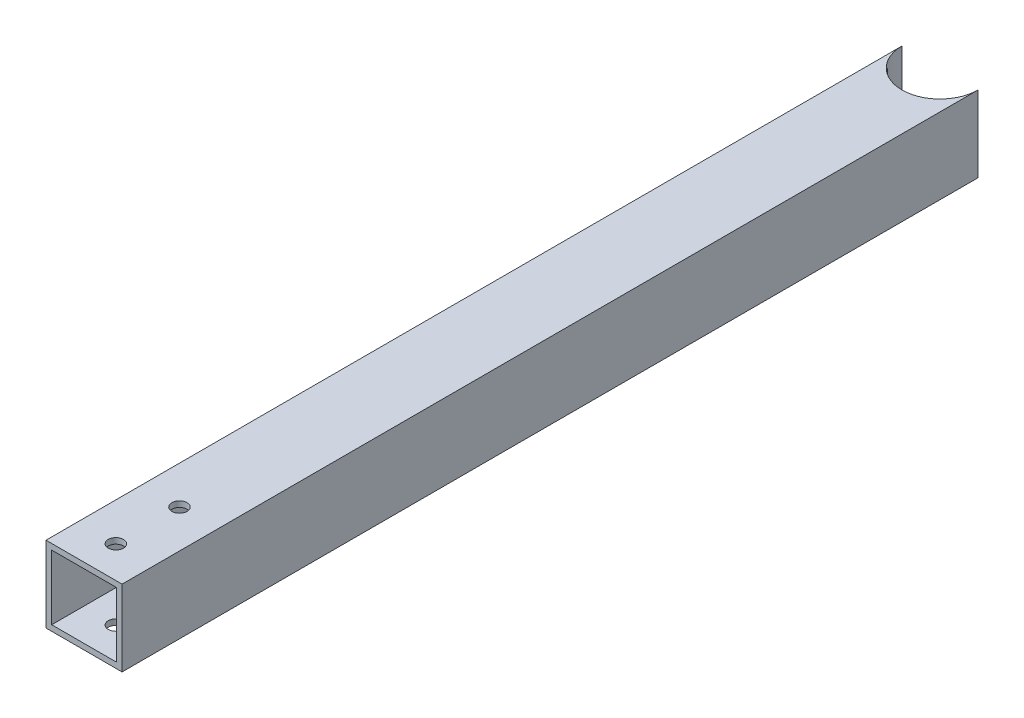
ISO-10303-21;
HEADER;
FILE_DESCRIPTION(('STEP AP214'),'2;1');
FILE_NAME('part.step','',(''),(''),'','','');
FILE_SCHEMA(('AUTOMOTIVE_DESIGN { 1 0 10303 214 1 1 1 1 }'));
ENDSEC;
DATA;
#1=APPLICATION_CONTEXT('core data for automotive mechanical design processes');
#2=APPLICATION_PROTOCOL_DEFINITION('international standard','automotive_design',2000,#1);
#3=PRODUCT_CONTEXT('',#1,'mechanical');
#4=PRODUCT('Part','Part','',(#3));
#5=PRODUCT_RELATED_PRODUCT_CATEGORY('part','',(#4));
#6=PRODUCT_DEFINITION_FORMATION('','',#4);
#7=PRODUCT_DEFINITION_CONTEXT('part definition',#1,'design');
#8=PRODUCT_DEFINITION('design','',#6,#7);
#9=PRODUCT_DEFINITION_SHAPE('','',#8);
#10=(LENGTH_UNIT() NAMED_UNIT(*) SI_UNIT(.MILLI.,.METRE.));
#11=(NAMED_UNIT(*) PLANE_ANGLE_UNIT() SI_UNIT($,.RADIAN.));
#12=(NAMED_UNIT(*) SI_UNIT($,.STERADIAN.) SOLID_ANGLE_UNIT());
#13=UNCERTAINTY_MEASURE_WITH_UNIT(LENGTH_MEASURE(1.E-05),#10,'distance_accuracy_value','');
#14=(GEOMETRIC_REPRESENTATION_CONTEXT(3) GLOBAL_UNCERTAINTY_ASSIGNED_CONTEXT((#13)) GLOBAL_UNIT_ASSIGNED_CONTEXT((#10,
#11,#12)) REPRESENTATION_CONTEXT('',''));
#15=CARTESIAN_POINT('',(0.,0.,0.));
#16=DIRECTION('',(0.,0.,1.));
#17=DIRECTION('',(1.,0.,0.));
#18=AXIS2_PLACEMENT_3D('',#15,#16,#17);
#19=CARTESIAN_POINT('',(0.,0.,450.));
#20=DIRECTION('',(0.,0.,-1.));
#21=DIRECTION('',(-1.,0.,0.));
#22=AXIS2_PLACEMENT_3D('',#19,#20,#21);
#23=PLANE('',#22);
#24=DIRECTION('',(0.,-1.,0.));
#25=VECTOR('',#24,1.);
#26=CARTESIAN_POINT('',(0.,0.,450.));
#27=LINE('',#26,#25);
#28=CARTESIAN_POINT('',(0.,40.,450.));
#29=VERTEX_POINT('',#28);
#30=CARTESIAN_POINT('',(0.,0.,450.));
#31=VERTEX_POINT('',#30);
#32=EDGE_CURVE('E133',#29,#31,#27,.T.);
#33=ORIENTED_EDGE('',*,*,#32,.T.);
#34=DIRECTION('',(1.,0.,0.));
#35=VECTOR('',#34,1.);
#36=CARTESIAN_POINT('',(0.,0.,450.));
#37=LINE('',#36,#35);
#38=CARTESIAN_POINT('',(40.,0.,450.));
#39=VERTEX_POINT('',#38);
#40=EDGE_CURVE('E207',#31,#39,#37,.T.);
#41=ORIENTED_EDGE('',*,*,#40,.T.);
#42=DIRECTION('',(0.,1.,0.));
#43=VECTOR('',#42,1.);
#44=CARTESIAN_POINT('',(40.,0.,450.));
#45=LINE('',#44,#43);
#46=CARTESIAN_POINT('',(40.,40.,450.));
#47=VERTEX_POINT('',#46);
#48=EDGE_CURVE('E210',#39,#47,#45,.T.);
#49=ORIENTED_EDGE('',*,*,#48,.T.);
#50=DIRECTION('',(-1.,0.,0.));
#51=VECTOR('',#50,1.);
#52=CARTESIAN_POINT('',(0.,40.,450.));
#53=LINE('',#52,#51);
#54=EDGE_CURVE('E136',#47,#29,#53,.T.);
#55=ORIENTED_EDGE('',*,*,#54,.T.);
#56=EDGE_LOOP('',(#33,#41,#49,#55));
#57=FACE_BOUND('',#56,.T.);
#58=DIRECTION('',(1.,0.,0.));
#59=VECTOR('',#58,1.);
#60=CARTESIAN_POINT('',(3.,3.,450.));
#61=LINE('',#60,#59);
#62=CARTESIAN_POINT('',(3.,3.,450.));
#63=VERTEX_POINT('',#62);
#64=CARTESIAN_POINT('',(37.,3.,450.));
#65=VERTEX_POINT('',#64);
#66=EDGE_CURVE('E178',#63,#65,#61,.T.);
#67=ORIENTED_EDGE('',*,*,#66,.F.);
#68=DIRECTION('',(0.,-1.,0.));
#69=VECTOR('',#68,1.);
#70=CARTESIAN_POINT('',(3.,3.,450.));
#71=LINE('',#70,#69);
#72=CARTESIAN_POINT('',(3.,37.,450.));
#73=VERTEX_POINT('',#72);
#74=EDGE_CURVE('E187',#73,#63,#71,.T.);
#75=ORIENTED_EDGE('',*,*,#74,.F.);
#76=DIRECTION('',(-1.,0.,0.));
#77=VECTOR('',#76,1.);
#78=CARTESIAN_POINT('',(3.,37.,450.));
#79=LINE('',#78,#77);
#80=CARTESIAN_POINT('',(37.,37.,450.));
#81=VERTEX_POINT('',#80);
#82=EDGE_CURVE('E184',#81,#73,#79,.T.);
#83=ORIENTED_EDGE('',*,*,#82,.F.);
#84=DIRECTION('',(0.,1.,0.));
#85=VECTOR('',#84,1.);
#86=CARTESIAN_POINT('',(37.,3.,450.));
#87=LINE('',#86,#85);
#88=EDGE_CURVE('E181',#65,#81,#87,.T.);
#89=ORIENTED_EDGE('',*,*,#88,.F.);
#90=EDGE_LOOP('',(#67,#75,#83,#89));
#91=FACE_BOUND('',#90,.T.);
#92=ADVANCED_FACE('F43',(#57,#91),#23,.F.);
#93=CARTESIAN_POINT('',(0.,0.,450.));
#94=DIRECTION('',(1.,0.,0.));
#95=DIRECTION('',(0.,1.,0.));
#96=AXIS2_PLACEMENT_3D('',#93,#94,#95);
#97=PLANE('',#96);
#98=DIRECTION('',(0.,-1.,0.));
#99=VECTOR('',#98,1.);
#100=CARTESIAN_POINT('',(0.,0.,0.));
#101=LINE('',#100,#99);
#102=CARTESIAN_POINT('',(0.,40.,0.));
#103=VERTEX_POINT('',#102);
#104=CARTESIAN_POINT('',(0.,0.,0.));
#105=VERTEX_POINT('',#104);
#106=EDGE_CURVE('E115',#103,#105,#101,.T.);
#107=ORIENTED_EDGE('',*,*,#106,.T.);
#108=DIRECTION('',(0.,0.,-1.));
#109=VECTOR('',#108,1.);
#110=CARTESIAN_POINT('',(0.,0.,450.));
#111=LINE('',#110,#109);
#112=EDGE_CURVE('E53',#31,#105,#111,.T.);
#113=ORIENTED_EDGE('',*,*,#112,.F.);
#114=ORIENTED_EDGE('',*,*,#32,.F.);
#115=DIRECTION('',(0.,0.,-1.));
#116=VECTOR('',#115,1.);
#117=CARTESIAN_POINT('',(0.,40.,450.));
#118=LINE('',#117,#116);
#119=EDGE_CURVE('E138',#29,#103,#118,.T.);
#120=ORIENTED_EDGE('',*,*,#119,.T.);
#121=EDGE_LOOP('',(#107,#113,#114,#120));
#122=FACE_BOUND('',#121,.T.);
#123=ADVANCED_FACE('F45',(#122),#97,.F.);
#124=CARTESIAN_POINT('',(0.,0.,450.));
#125=DIRECTION('',(0.,1.,0.));
#126=DIRECTION('',(0.,0.,1.));
#127=AXIS2_PLACEMENT_3D('',#124,#125,#126);
#128=PLANE('',#127);
#129=CARTESIAN_POINT('',(20.,0.,433.273109788451));
#130=DIRECTION('',(0.,1.,0.));
#131=DIRECTION('',(0.,0.,1.));
#132=AXIS2_PLACEMENT_3D('',#129,#130,#131);
#133=CIRCLE('',#132,4.00000000000002);
#134=CARTESIAN_POINT('',(20.,0.,437.273109788451));
#135=VERTEX_POINT('',#134);
#136=EDGE_CURVE('E174',#135,#135,#133,.T.);
#137=ORIENTED_EDGE('',*,*,#136,.T.);
#138=EDGE_LOOP('',(#137));
#139=FACE_BOUND('',#138,.T.);
#140=CARTESIAN_POINT('',(20.,0.,399.819329365352));
#141=DIRECTION('',(0.,1.,0.));
#142=DIRECTION('',(0.,0.,1.));
#143=AXIS2_PLACEMENT_3D('',#140,#141,#142);
#144=CIRCLE('',#143,4.00000000000002);
#145=CARTESIAN_POINT('',(20.,0.,403.819329365352));
#146=VERTEX_POINT('',#145);
#147=EDGE_CURVE('E157',#146,#146,#144,.T.);
#148=ORIENTED_EDGE('',*,*,#147,.T.);
#149=EDGE_LOOP('',(#148));
#150=FACE_BOUND('',#149,.T.);
#151=ORIENTED_EDGE('',*,*,#112,.T.);
#152=CARTESIAN_POINT('',(20.,0.,0.));
#153=DIRECTION('',(0.,1.,0.));
#154=DIRECTION('',(0.,0.,1.));
#155=AXIS2_PLACEMENT_3D('',#152,#153,#154);
#156=CIRCLE('',#155,20.);
#157=CARTESIAN_POINT('',(40.,0.,0.));
#158=VERTEX_POINT('',#157);
#159=EDGE_CURVE('E151',#105,#158,#156,.T.);
#160=ORIENTED_EDGE('',*,*,#159,.T.);
#161=DIRECTION('',(0.,0.,-1.));
#162=VECTOR('',#161,1.);
#163=CARTESIAN_POINT('',(40.,0.,450.));
#164=LINE('',#163,#162);
#165=EDGE_CURVE('E131',#39,#158,#164,.T.);
#166=ORIENTED_EDGE('',*,*,#165,.F.);
#167=ORIENTED_EDGE('',*,*,#40,.F.);
#168=EDGE_LOOP('',(#151,#160,#166,#167));
#169=FACE_BOUND('',#168,.T.);
#170=ADVANCED_FACE('F221',(#139,#150,#169),#128,.F.);
#171=CARTESIAN_POINT('',(40.,0.,450.));
#172=DIRECTION('',(-1.,0.,0.));
#173=DIRECTION('',(0.,-1.,0.));
#174=AXIS2_PLACEMENT_3D('',#171,#172,#173);
#175=PLANE('',#174);
#176=DIRECTION('',(0.,1.,0.));
#177=VECTOR('',#176,1.);
#178=CARTESIAN_POINT('',(40.,0.,0.));
#179=LINE('',#178,#177);
#180=CARTESIAN_POINT('',(40.,40.,0.));
#181=VERTEX_POINT('',#180);
#182=EDGE_CURVE('E112',#158,#181,#179,.T.);
#183=ORIENTED_EDGE('',*,*,#182,.T.);
#184=DIRECTION('',(0.,0.,-1.));
#185=VECTOR('',#184,1.);
#186=CARTESIAN_POINT('',(40.,40.,450.));
#187=LINE('',#186,#185);
#188=EDGE_CURVE('E128',#47,#181,#187,.T.);
#189=ORIENTED_EDGE('',*,*,#188,.F.);
#190=ORIENTED_EDGE('',*,*,#48,.F.);
#191=ORIENTED_EDGE('',*,*,#165,.T.);
#192=EDGE_LOOP('',(#183,#189,#190,#191));
#193=FACE_BOUND('',#192,.T.);
#194=ADVANCED_FACE('F126',(#193),#175,.F.);
#195=CARTESIAN_POINT('',(0.,40.,450.));
#196=DIRECTION('',(0.,-1.,0.));
#197=DIRECTION('',(0.,0.,-1.));
#198=AXIS2_PLACEMENT_3D('',#195,#196,#197);
#199=PLANE('',#198);
#200=CARTESIAN_POINT('',(20.,40.,433.273109788451));
#201=DIRECTION('',(0.,1.,0.));
#202=DIRECTION('',(0.,0.,1.));
#203=AXIS2_PLACEMENT_3D('',#200,#201,#202);
#204=CIRCLE('',#203,4.00000000000002);
#205=CARTESIAN_POINT('',(20.,40.,437.273109788451));
#206=VERTEX_POINT('',#205);
#207=EDGE_CURVE('E121',#206,#206,#204,.T.);
#208=ORIENTED_EDGE('',*,*,#207,.F.);
#209=EDGE_LOOP('',(#208));
#210=FACE_BOUND('',#209,.T.);
#211=CARTESIAN_POINT('',(20.,40.,399.819329365352));
#212=DIRECTION('',(0.,1.,0.));
#213=DIRECTION('',(0.,0.,1.));
#214=AXIS2_PLACEMENT_3D('',#211,#212,#213);
#215=CIRCLE('',#214,4.00000000000002);
#216=CARTESIAN_POINT('',(20.,40.,403.819329365352));
#217=VERTEX_POINT('',#216);
#218=EDGE_CURVE('E250',#217,#217,#215,.T.);
#219=ORIENTED_EDGE('',*,*,#218,.F.);
#220=EDGE_LOOP('',(#219));
#221=FACE_BOUND('',#220,.T.);
#222=ORIENTED_EDGE('',*,*,#188,.T.);
#223=CARTESIAN_POINT('',(20.,40.,0.));
#224=DIRECTION('',(0.,1.,0.));
#225=DIRECTION('',(0.,0.,1.));
#226=AXIS2_PLACEMENT_3D('',#223,#224,#225);
#227=CIRCLE('',#226,20.);
#228=EDGE_CURVE('E109',#103,#181,#227,.T.);
#229=ORIENTED_EDGE('',*,*,#228,.F.);
#230=ORIENTED_EDGE('',*,*,#119,.F.);
#231=ORIENTED_EDGE('',*,*,#54,.F.);
#232=EDGE_LOOP('',(#222,#229,#230,#231));
#233=FACE_BOUND('',#232,.T.);
#234=ADVANCED_FACE('F135',(#210,#221,#233),#199,.F.);
#235=CARTESIAN_POINT('',(3.,3.,450.));
#236=DIRECTION('',(0.,1.,0.));
#237=DIRECTION('',(0.,0.,1.));
#238=AXIS2_PLACEMENT_3D('',#235,#236,#237);
#239=PLANE('',#238);
#240=CARTESIAN_POINT('',(20.,3.,0.));
#241=DIRECTION('',(0.,1.,0.));
#242=DIRECTION('',(0.,0.,1.));
#243=AXIS2_PLACEMENT_3D('',#240,#241,#242);
#244=CIRCLE('',#243,20.);
#245=CARTESIAN_POINT('',(3.,3.,10.5356537528527));
#246=VERTEX_POINT('',#245);
#247=CARTESIAN_POINT('',(37.0000000000001,3.,10.5356537528525));
#248=VERTEX_POINT('',#247);
#249=EDGE_CURVE('E159',#246,#248,#244,.T.);
#250=ORIENTED_EDGE('',*,*,#249,.F.);
#251=DIRECTION('',(0.,0.,-1.));
#252=VECTOR('',#251,1.);
#253=CARTESIAN_POINT('',(3.,3.,450.));
#254=LINE('',#253,#252);
#255=EDGE_CURVE('E190',#63,#246,#254,.T.);
#256=ORIENTED_EDGE('',*,*,#255,.F.);
#257=ORIENTED_EDGE('',*,*,#66,.T.);
#258=DIRECTION('',(0.,0.,-1.));
#259=VECTOR('',#258,1.);
#260=CARTESIAN_POINT('',(37.,3.,450.));
#261=LINE('',#260,#259);
#262=EDGE_CURVE('E200',#65,#248,#261,.T.);
#263=ORIENTED_EDGE('',*,*,#262,.T.);
#264=EDGE_LOOP('',(#250,#256,#257,#263));
#265=FACE_BOUND('',#264,.T.);
#266=CARTESIAN_POINT('',(20.,3.,433.273109788451));
#267=DIRECTION('',(0.,1.,0.));
#268=DIRECTION('',(0.,0.,1.));
#269=AXIS2_PLACEMENT_3D('',#266,#267,#268);
#270=CIRCLE('',#269,4.00000000000002);
#271=CARTESIAN_POINT('',(20.,3.,437.273109788451));
#272=VERTEX_POINT('',#271);
#273=EDGE_CURVE('E170',#272,#272,#270,.T.);
#274=ORIENTED_EDGE('',*,*,#273,.F.);
#275=EDGE_LOOP('',(#274));
#276=FACE_BOUND('',#275,.T.);
#277=CARTESIAN_POINT('',(20.,3.,399.819329365352));
#278=DIRECTION('',(0.,1.,0.));
#279=DIRECTION('',(0.,0.,1.));
#280=AXIS2_PLACEMENT_3D('',#277,#278,#279);
#281=CIRCLE('',#280,4.00000000000002);
#282=CARTESIAN_POINT('',(20.,3.,403.819329365352));
#283=VERTEX_POINT('',#282);
#284=EDGE_CURVE('E150',#283,#283,#281,.T.);
#285=ORIENTED_EDGE('',*,*,#284,.F.);
#286=EDGE_LOOP('',(#285));
#287=FACE_BOUND('',#286,.T.);
#288=ADVANCED_FACE('F236',(#265,#276,#287),#239,.T.);
#289=CARTESIAN_POINT('',(37.,3.,450.));
#290=DIRECTION('',(-1.,0.,0.));
#291=DIRECTION('',(0.,-1.,0.));
#292=AXIS2_PLACEMENT_3D('',#289,#290,#291);
#293=PLANE('',#292);
#294=DIRECTION('',(0.,1.,0.));
#295=VECTOR('',#294,1.);
#296=CARTESIAN_POINT('',(37.0000000000001,-560.,10.5356537528525));
#297=LINE('',#296,#295);
#298=CARTESIAN_POINT('',(37.,37.,10.5356537528527));
#299=VERTEX_POINT('',#298);
#300=EDGE_CURVE('E163',#248,#299,#297,.T.);
#301=ORIENTED_EDGE('',*,*,#300,.F.);
#302=ORIENTED_EDGE('',*,*,#262,.F.);
#303=ORIENTED_EDGE('',*,*,#88,.T.);
#304=DIRECTION('',(0.,0.,-1.));
#305=VECTOR('',#304,1.);
#306=CARTESIAN_POINT('',(37.,37.,450.));
#307=LINE('',#306,#305);
#308=EDGE_CURVE('E196',#81,#299,#307,.T.);
#309=ORIENTED_EDGE('',*,*,#308,.T.);
#310=EDGE_LOOP('',(#301,#302,#303,#309));
#311=FACE_BOUND('',#310,.T.);
#312=ADVANCED_FACE('F243',(#311),#293,.T.);
#313=CARTESIAN_POINT('',(3.,37.,450.));
#314=DIRECTION('',(0.,-1.,0.));
#315=DIRECTION('',(0.,0.,-1.));
#316=AXIS2_PLACEMENT_3D('',#313,#314,#315);
#317=PLANE('',#316);
#318=CARTESIAN_POINT('',(20.,37.,0.));
#319=DIRECTION('',(0.,-1.,0.));
#320=DIRECTION('',(0.,0.,-1.));
#321=AXIS2_PLACEMENT_3D('',#318,#319,#320);
#322=CIRCLE('',#321,20.);
#323=CARTESIAN_POINT('',(3.,37.,10.5356537528528));
#324=VERTEX_POINT('',#323);
#325=EDGE_CURVE('E60',#299,#324,#322,.T.);
#326=ORIENTED_EDGE('',*,*,#325,.F.);
#327=ORIENTED_EDGE('',*,*,#308,.F.);
#328=ORIENTED_EDGE('',*,*,#82,.T.);
#329=DIRECTION('',(0.,0.,-1.));
#330=VECTOR('',#329,1.);
#331=CARTESIAN_POINT('',(3.,37.,450.));
#332=LINE('',#331,#330);
#333=EDGE_CURVE('E67',#73,#324,#332,.T.);
#334=ORIENTED_EDGE('',*,*,#333,.T.);
#335=EDGE_LOOP('',(#326,#327,#328,#334));
#336=FACE_BOUND('',#335,.T.);
#337=CARTESIAN_POINT('',(20.,37.,433.273109788451));
#338=DIRECTION('',(0.,-1.,0.));
#339=DIRECTION('',(0.,0.,-1.));
#340=AXIS2_PLACEMENT_3D('',#337,#338,#339);
#341=CIRCLE('',#340,4.00000000000002);
#342=CARTESIAN_POINT('',(20.,37.,429.273109788451));
#343=VERTEX_POINT('',#342);
#344=EDGE_CURVE('E47',#343,#343,#341,.T.);
#345=ORIENTED_EDGE('',*,*,#344,.F.);
#346=EDGE_LOOP('',(#345));
#347=FACE_BOUND('',#346,.T.);
#348=CARTESIAN_POINT('',(20.,37.,399.819329365352));
#349=DIRECTION('',(0.,-1.,0.));
#350=DIRECTION('',(0.,0.,-1.));
#351=AXIS2_PLACEMENT_3D('',#348,#349,#350);
#352=CIRCLE('',#351,4.00000000000002);
#353=CARTESIAN_POINT('',(20.,37.,395.819329365352));
#354=VERTEX_POINT('',#353);
#355=EDGE_CURVE('E147',#354,#354,#352,.T.);
#356=ORIENTED_EDGE('',*,*,#355,.F.);
#357=EDGE_LOOP('',(#356));
#358=FACE_BOUND('',#357,.T.);
#359=ADVANCED_FACE('F265',(#336,#347,#358),#317,.T.);
#360=CARTESIAN_POINT('',(3.,3.,450.));
#361=DIRECTION('',(1.,0.,0.));
#362=DIRECTION('',(0.,0.,-1.));
#363=AXIS2_PLACEMENT_3D('',#360,#361,#362);
#364=PLANE('',#363);
#365=DIRECTION('',(0.,1.,0.));
#366=VECTOR('',#365,1.);
#367=CARTESIAN_POINT('',(3.,-560.,10.5356537528527));
#368=LINE('',#367,#366);
#369=EDGE_CURVE('E11',#324,#246,#368,.F.);
#370=ORIENTED_EDGE('',*,*,#369,.F.);
#371=ORIENTED_EDGE('',*,*,#333,.F.);
#372=ORIENTED_EDGE('',*,*,#74,.T.);
#373=ORIENTED_EDGE('',*,*,#255,.T.);
#374=EDGE_LOOP('',(#370,#371,#372,#373));
#375=FACE_BOUND('',#374,.T.);
#376=ADVANCED_FACE('F272',(#375),#364,.T.);
#377=CARTESIAN_POINT('',(20.,-560.,0.));
#378=DIRECTION('',(0.,1.,0.));
#379=DIRECTION('',(0.,0.,1.));
#380=AXIS2_PLACEMENT_3D('',#377,#378,#379);
#381=CYLINDRICAL_SURFACE('',#380,20.);
#382=ORIENTED_EDGE('',*,*,#106,.F.);
#383=ORIENTED_EDGE('',*,*,#228,.T.);
#384=ORIENTED_EDGE('',*,*,#182,.F.);
#385=ORIENTED_EDGE('',*,*,#159,.F.);
#386=EDGE_LOOP('',(#382,#383,#384,#385));
#387=FACE_BOUND('',#386,.T.);
#388=ORIENTED_EDGE('',*,*,#249,.T.);
#389=ORIENTED_EDGE('',*,*,#300,.T.);
#390=ORIENTED_EDGE('',*,*,#325,.T.);
#391=ORIENTED_EDGE('',*,*,#369,.T.);
#392=EDGE_LOOP('',(#388,#389,#390,#391));
#393=FACE_BOUND('',#392,.T.);
#394=ADVANCED_FACE('F111',(#387,#393),#381,.F.);
#395=CARTESIAN_POINT('',(20.,-560.,399.819329365352));
#396=DIRECTION('',(0.,1.,0.));
#397=DIRECTION('',(0.,0.,1.));
#398=AXIS2_PLACEMENT_3D('',#395,#396,#397);
#399=CYLINDRICAL_SURFACE('',#398,4.00000000000002);
#400=ORIENTED_EDGE('',*,*,#355,.T.);
#401=EDGE_LOOP('',(#400));
#402=FACE_BOUND('',#401,.T.);
#403=ORIENTED_EDGE('',*,*,#218,.T.);
#404=EDGE_LOOP('',(#403));
#405=FACE_BOUND('',#404,.T.);
#406=ADVANCED_FACE('F284',(#402,#405),#399,.F.);
#407=CARTESIAN_POINT('',(20.,-560.,433.273109788451));
#408=DIRECTION('',(0.,1.,0.));
#409=DIRECTION('',(0.,0.,1.));
#410=AXIS2_PLACEMENT_3D('',#407,#408,#409);
#411=CYLINDRICAL_SURFACE('',#410,4.00000000000002);
#412=ORIENTED_EDGE('',*,*,#344,.T.);
#413=EDGE_LOOP('',(#412));
#414=FACE_BOUND('',#413,.T.);
#415=ORIENTED_EDGE('',*,*,#207,.T.);
#416=EDGE_LOOP('',(#415));
#417=FACE_BOUND('',#416,.T.);
#418=ADVANCED_FACE('F282',(#414,#417),#411,.F.);
#419=ORIENTED_EDGE('',*,*,#284,.T.);
#420=EDGE_LOOP('',(#419));
#421=FACE_BOUND('',#420,.T.);
#422=ORIENTED_EDGE('',*,*,#147,.F.);
#423=EDGE_LOOP('',(#422));
#424=FACE_BOUND('',#423,.T.);
#425=ADVANCED_FACE('F278',(#421,#424),#399,.F.);
#426=ORIENTED_EDGE('',*,*,#273,.T.);
#427=EDGE_LOOP('',(#426));
#428=FACE_BOUND('',#427,.T.);
#429=ORIENTED_EDGE('',*,*,#136,.F.);
#430=EDGE_LOOP('',(#429));
#431=FACE_BOUND('',#430,.T.);
#432=ADVANCED_FACE('F281',(#428,#431),#411,.F.);
#433=CLOSED_SHELL('',(#92,#123,#170,#194,#234,#288,#312,#359,#376,#394,#406,#418,#425,#432));
#434=MANIFOLD_SOLID_BREP('B2',#433);
#435=ADVANCED_BREP_SHAPE_REPRESENTATION('',(#18,#434),#14);
#436=SHAPE_DEFINITION_REPRESENTATION(#9,#435);
ENDSEC;
END-ISO-10303-21;
